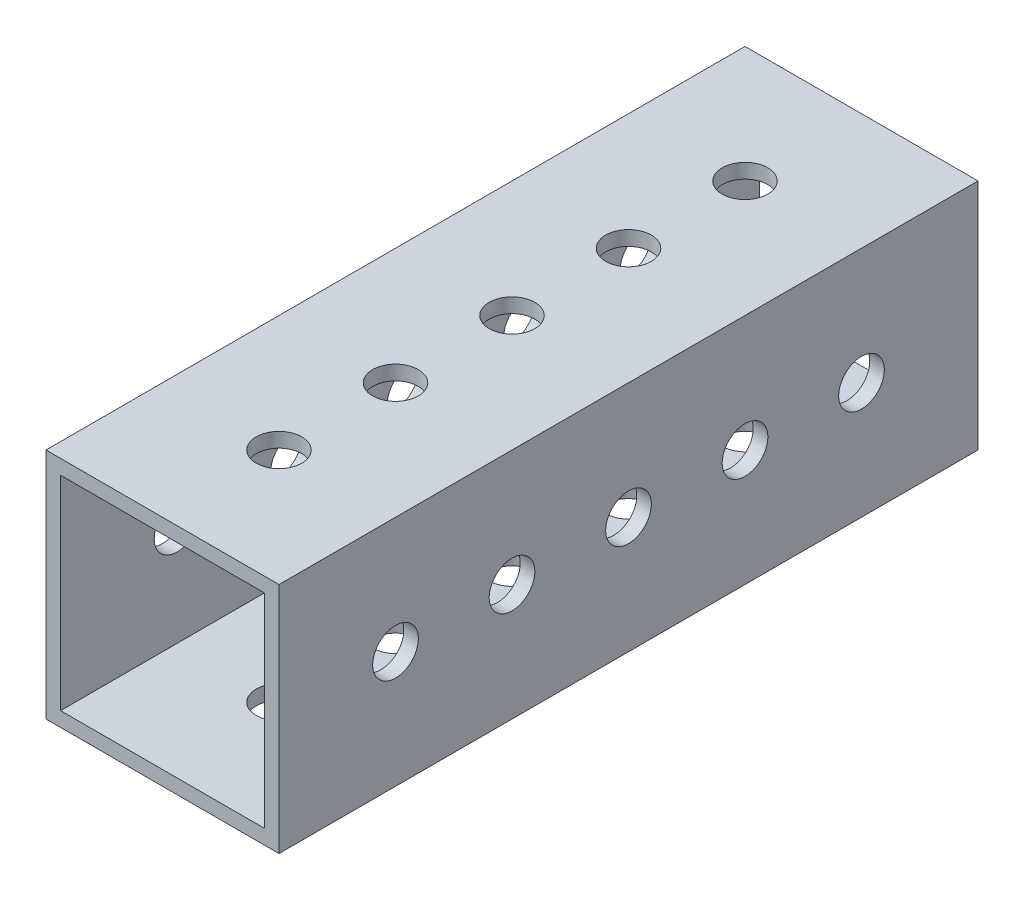
ISO-10303-21;
HEADER;
FILE_DESCRIPTION(('STEP AP214'),'2;1');
FILE_NAME('part.step','',(''),(''),'','','');
FILE_SCHEMA(('AUTOMOTIVE_DESIGN { 1 0 10303 214 1 1 1 1 }'));
ENDSEC;
DATA;
#1=APPLICATION_CONTEXT('core data for automotive mechanical design processes');
#2=APPLICATION_PROTOCOL_DEFINITION('international standard','automotive_design',2000,#1);
#3=PRODUCT_CONTEXT('',#1,'mechanical');
#4=PRODUCT('Part','Part','',(#3));
#5=PRODUCT_RELATED_PRODUCT_CATEGORY('part','',(#4));
#6=PRODUCT_DEFINITION_FORMATION('','',#4);
#7=PRODUCT_DEFINITION_CONTEXT('part definition',#1,'design');
#8=PRODUCT_DEFINITION('design','',#6,#7);
#9=PRODUCT_DEFINITION_SHAPE('','',#8);
#10=(LENGTH_UNIT() NAMED_UNIT(*) SI_UNIT(.MILLI.,.METRE.));
#11=(NAMED_UNIT(*) PLANE_ANGLE_UNIT() SI_UNIT($,.RADIAN.));
#12=(NAMED_UNIT(*) SI_UNIT($,.STERADIAN.) SOLID_ANGLE_UNIT());
#13=UNCERTAINTY_MEASURE_WITH_UNIT(LENGTH_MEASURE(1.E-05),#10,'distance_accuracy_value','');
#14=(GEOMETRIC_REPRESENTATION_CONTEXT(3) GLOBAL_UNCERTAINTY_ASSIGNED_CONTEXT((#13)) GLOBAL_UNIT_ASSIGNED_CONTEXT((#10,
#11,#12)) REPRESENTATION_CONTEXT('',''));
#15=CARTESIAN_POINT('',(0.,0.,0.));
#16=DIRECTION('',(0.,0.,1.));
#17=DIRECTION('',(1.,0.,0.));
#18=AXIS2_PLACEMENT_3D('',#15,#16,#17);
#19=CARTESIAN_POINT('',(0.,0.,38.1));
#20=DIRECTION('',(0.,0.,-1.));
#21=DIRECTION('',(-1.,0.,0.));
#22=AXIS2_PLACEMENT_3D('',#19,#20,#21);
#23=PLANE('',#22);
#24=DIRECTION('',(0.,1.,0.));
#25=VECTOR('',#24,1.);
#26=CARTESIAN_POINT('',(12.7,-12.7,38.1));
#27=LINE('',#26,#25);
#28=CARTESIAN_POINT('',(12.7,-12.7,38.1));
#29=VERTEX_POINT('',#28);
#30=CARTESIAN_POINT('',(12.7,12.7,38.1));
#31=VERTEX_POINT('',#30);
#32=EDGE_CURVE('E154',#29,#31,#27,.T.);
#33=ORIENTED_EDGE('',*,*,#32,.T.);
#34=DIRECTION('',(-1.,0.,0.));
#35=VECTOR('',#34,1.);
#36=CARTESIAN_POINT('',(-12.7,12.7,38.1));
#37=LINE('',#36,#35);
#38=CARTESIAN_POINT('',(-12.7,12.7,38.1));
#39=VERTEX_POINT('',#38);
#40=EDGE_CURVE('E158',#31,#39,#37,.T.);
#41=ORIENTED_EDGE('',*,*,#40,.T.);
#42=DIRECTION('',(0.,-1.,0.));
#43=VECTOR('',#42,1.);
#44=CARTESIAN_POINT('',(-12.7,-12.7,38.1));
#45=LINE('',#44,#43);
#46=CARTESIAN_POINT('',(-12.7,-12.7,38.1));
#47=VERTEX_POINT('',#46);
#48=EDGE_CURVE('E162',#39,#47,#45,.T.);
#49=ORIENTED_EDGE('',*,*,#48,.T.);
#50=DIRECTION('',(1.,0.,0.));
#51=VECTOR('',#50,1.);
#52=CARTESIAN_POINT('',(-12.7,-12.7,38.1));
#53=LINE('',#52,#51);
#54=EDGE_CURVE('E165',#47,#29,#53,.T.);
#55=ORIENTED_EDGE('',*,*,#54,.T.);
#56=EDGE_LOOP('',(#33,#41,#49,#55));
#57=FACE_BOUND('',#56,.T.);
#58=DIRECTION('',(0.,1.,0.));
#59=VECTOR('',#58,1.);
#60=CARTESIAN_POINT('',(11.1125,0.,38.1));
#61=LINE('',#60,#59);
#62=CARTESIAN_POINT('',(11.1125,-11.1125,38.1));
#63=VERTEX_POINT('',#62);
#64=CARTESIAN_POINT('',(11.1125,11.1125,38.1));
#65=VERTEX_POINT('',#64);
#66=EDGE_CURVE('E136',#63,#65,#61,.T.);
#67=ORIENTED_EDGE('',*,*,#66,.F.);
#68=DIRECTION('',(1.,0.,0.));
#69=VECTOR('',#68,1.);
#70=CARTESIAN_POINT('',(0.,-11.1125,38.1));
#71=LINE('',#70,#69);
#72=CARTESIAN_POINT('',(-11.1125,-11.1125,38.1));
#73=VERTEX_POINT('',#72);
#74=EDGE_CURVE('E117',#73,#63,#71,.T.);
#75=ORIENTED_EDGE('',*,*,#74,.F.);
#76=DIRECTION('',(0.,-1.,0.));
#77=VECTOR('',#76,1.);
#78=CARTESIAN_POINT('',(-11.1125,0.,38.1));
#79=LINE('',#78,#77);
#80=CARTESIAN_POINT('',(-11.1125,11.1125,38.1));
#81=VERTEX_POINT('',#80);
#82=EDGE_CURVE('E149',#81,#73,#79,.T.);
#83=ORIENTED_EDGE('',*,*,#82,.F.);
#84=DIRECTION('',(-1.,0.,0.));
#85=VECTOR('',#84,1.);
#86=CARTESIAN_POINT('',(0.,11.1125,38.1));
#87=LINE('',#86,#85);
#88=EDGE_CURVE('E140',#65,#81,#87,.T.);
#89=ORIENTED_EDGE('',*,*,#88,.F.);
#90=EDGE_LOOP('',(#67,#75,#83,#89));
#91=FACE_BOUND('',#90,.T.);
#92=ADVANCED_FACE('F44',(#57,#91),#23,.F.);
#93=CARTESIAN_POINT('',(0.,0.,-38.1));
#94=DIRECTION('',(0.,0.,-1.));
#95=DIRECTION('',(-1.,0.,0.));
#96=AXIS2_PLACEMENT_3D('',#93,#94,#95);
#97=PLANE('',#96);
#98=DIRECTION('',(0.,1.,0.));
#99=VECTOR('',#98,1.);
#100=CARTESIAN_POINT('',(12.7,-12.7,-38.1));
#101=LINE('',#100,#99);
#102=CARTESIAN_POINT('',(12.7,-12.7,-38.1));
#103=VERTEX_POINT('',#102);
#104=CARTESIAN_POINT('',(12.7,12.7,-38.1));
#105=VERTEX_POINT('',#104);
#106=EDGE_CURVE('E169',#103,#105,#101,.T.);
#107=ORIENTED_EDGE('',*,*,#106,.F.);
#108=DIRECTION('',(1.,0.,0.));
#109=VECTOR('',#108,1.);
#110=CARTESIAN_POINT('',(-12.7,-12.7,-38.1));
#111=LINE('',#110,#109);
#112=CARTESIAN_POINT('',(-12.7,-12.7,-38.1));
#113=VERTEX_POINT('',#112);
#114=EDGE_CURVE('E159',#113,#103,#111,.T.);
#115=ORIENTED_EDGE('',*,*,#114,.F.);
#116=DIRECTION('',(0.,-1.,0.));
#117=VECTOR('',#116,1.);
#118=CARTESIAN_POINT('',(-12.7,-12.7,-38.1));
#119=LINE('',#118,#117);
#120=CARTESIAN_POINT('',(-12.7,12.7,-38.1));
#121=VERTEX_POINT('',#120);
#122=EDGE_CURVE('E176',#121,#113,#119,.T.);
#123=ORIENTED_EDGE('',*,*,#122,.F.);
#124=DIRECTION('',(-1.,0.,0.));
#125=VECTOR('',#124,1.);
#126=CARTESIAN_POINT('',(-12.7,12.7,-38.1));
#127=LINE('',#126,#125);
#128=EDGE_CURVE('E173',#105,#121,#127,.T.);
#129=ORIENTED_EDGE('',*,*,#128,.F.);
#130=EDGE_LOOP('',(#107,#115,#123,#129));
#131=FACE_BOUND('',#130,.T.);
#132=DIRECTION('',(1.,0.,0.));
#133=VECTOR('',#132,1.);
#134=CARTESIAN_POINT('',(0.,-11.1125,-38.1));
#135=LINE('',#134,#133);
#136=CARTESIAN_POINT('',(-11.1125,-11.1125,-38.1));
#137=VERTEX_POINT('',#136);
#138=CARTESIAN_POINT('',(11.1125,-11.1125,-38.1));
#139=VERTEX_POINT('',#138);
#140=EDGE_CURVE('E115',#137,#139,#135,.T.);
#141=ORIENTED_EDGE('',*,*,#140,.T.);
#142=DIRECTION('',(0.,1.,0.));
#143=VECTOR('',#142,1.);
#144=CARTESIAN_POINT('',(11.1125,0.,-38.1));
#145=LINE('',#144,#143);
#146=CARTESIAN_POINT('',(11.1125,11.1125,-38.1));
#147=VERTEX_POINT('',#146);
#148=EDGE_CURVE('E124',#139,#147,#145,.T.);
#149=ORIENTED_EDGE('',*,*,#148,.T.);
#150=DIRECTION('',(-1.,0.,0.));
#151=VECTOR('',#150,1.);
#152=CARTESIAN_POINT('',(0.,11.1125,-38.1));
#153=LINE('',#152,#151);
#154=CARTESIAN_POINT('',(-11.1125,11.1125,-38.1));
#155=VERTEX_POINT('',#154);
#156=EDGE_CURVE('E131',#147,#155,#153,.T.);
#157=ORIENTED_EDGE('',*,*,#156,.T.);
#158=DIRECTION('',(0.,-1.,0.));
#159=VECTOR('',#158,1.);
#160=CARTESIAN_POINT('',(-11.1125,0.,-38.1));
#161=LINE('',#160,#159);
#162=EDGE_CURVE('E69',#155,#137,#161,.T.);
#163=ORIENTED_EDGE('',*,*,#162,.T.);
#164=EDGE_LOOP('',(#141,#149,#157,#163));
#165=FACE_BOUND('',#164,.T.);
#166=ADVANCED_FACE('F134',(#131,#165),#97,.T.);
#167=CARTESIAN_POINT('',(12.7,-12.7,38.1));
#168=DIRECTION('',(-1.,0.,0.));
#169=DIRECTION('',(0.,0.,1.));
#170=AXIS2_PLACEMENT_3D('',#167,#168,#169);
#171=PLANE('',#170);
#172=CARTESIAN_POINT('',(12.7,0.,-25.4));
#173=DIRECTION('',(-1.,0.,0.));
#174=DIRECTION('',(0.,0.,1.));
#175=AXIS2_PLACEMENT_3D('',#172,#173,#174);
#176=CIRCLE('',#175,2.4892);
#177=CARTESIAN_POINT('',(12.7,0.,-22.9108));
#178=VERTEX_POINT('',#177);
#179=EDGE_CURVE('E221',#178,#178,#176,.T.);
#180=ORIENTED_EDGE('',*,*,#179,.T.);
#181=EDGE_LOOP('',(#180));
#182=FACE_BOUND('',#181,.T.);
#183=CARTESIAN_POINT('',(12.7,0.,-12.7));
#184=DIRECTION('',(-1.,0.,0.));
#185=DIRECTION('',(0.,0.,1.));
#186=AXIS2_PLACEMENT_3D('',#183,#184,#185);
#187=CIRCLE('',#186,2.4892);
#188=CARTESIAN_POINT('',(12.7,0.,-10.2108));
#189=VERTEX_POINT('',#188);
#190=EDGE_CURVE('E505',#189,#189,#187,.T.);
#191=ORIENTED_EDGE('',*,*,#190,.T.);
#192=EDGE_LOOP('',(#191));
#193=FACE_BOUND('',#192,.T.);
#194=CARTESIAN_POINT('',(12.7,0.,0.));
#195=DIRECTION('',(-1.,0.,0.));
#196=DIRECTION('',(0.,0.,1.));
#197=AXIS2_PLACEMENT_3D('',#194,#195,#196);
#198=CIRCLE('',#197,2.4892);
#199=CARTESIAN_POINT('',(12.7,0.,2.4892));
#200=VERTEX_POINT('',#199);
#201=EDGE_CURVE('E513',#200,#200,#198,.T.);
#202=ORIENTED_EDGE('',*,*,#201,.T.);
#203=EDGE_LOOP('',(#202));
#204=FACE_BOUND('',#203,.T.);
#205=CARTESIAN_POINT('',(12.7,0.,12.7));
#206=DIRECTION('',(-1.,0.,0.));
#207=DIRECTION('',(0.,0.,1.));
#208=AXIS2_PLACEMENT_3D('',#205,#206,#207);
#209=CIRCLE('',#208,2.4892);
#210=CARTESIAN_POINT('',(12.7,0.,15.1892));
#211=VERTEX_POINT('',#210);
#212=EDGE_CURVE('E521',#211,#211,#209,.T.);
#213=ORIENTED_EDGE('',*,*,#212,.T.);
#214=EDGE_LOOP('',(#213));
#215=FACE_BOUND('',#214,.T.);
#216=CARTESIAN_POINT('',(12.7,0.,25.4));
#217=DIRECTION('',(-1.,0.,0.));
#218=DIRECTION('',(0.,0.,1.));
#219=AXIS2_PLACEMENT_3D('',#216,#217,#218);
#220=CIRCLE('',#219,2.4892);
#221=CARTESIAN_POINT('',(12.7,0.,27.8892));
#222=VERTEX_POINT('',#221);
#223=EDGE_CURVE('E529',#222,#222,#220,.T.);
#224=ORIENTED_EDGE('',*,*,#223,.T.);
#225=EDGE_LOOP('',(#224));
#226=FACE_BOUND('',#225,.T.);
#227=ORIENTED_EDGE('',*,*,#106,.T.);
#228=DIRECTION('',(0.,0.,-1.));
#229=VECTOR('',#228,1.);
#230=CARTESIAN_POINT('',(12.7,12.7,38.1));
#231=LINE('',#230,#229);
#232=EDGE_CURVE('E11',#31,#105,#231,.T.);
#233=ORIENTED_EDGE('',*,*,#232,.F.);
#234=ORIENTED_EDGE('',*,*,#32,.F.);
#235=DIRECTION('',(0.,0.,-1.));
#236=VECTOR('',#235,1.);
#237=CARTESIAN_POINT('',(12.7,-12.7,38.1));
#238=LINE('',#237,#236);
#239=EDGE_CURVE('E168',#29,#103,#238,.T.);
#240=ORIENTED_EDGE('',*,*,#239,.T.);
#241=EDGE_LOOP('',(#227,#233,#234,#240));
#242=FACE_BOUND('',#241,.T.);
#243=ADVANCED_FACE('F46',(#182,#193,#204,#215,#226,#242),#171,.F.);
#244=CARTESIAN_POINT('',(-12.7,12.7,38.1));
#245=DIRECTION('',(0.,-1.,0.));
#246=DIRECTION('',(0.,0.,-1.));
#247=AXIS2_PLACEMENT_3D('',#244,#245,#246);
#248=PLANE('',#247);
#249=CARTESIAN_POINT('',(0.,12.7,25.4));
#250=DIRECTION('',(0.,1.,0.));
#251=DIRECTION('',(0.,0.,1.));
#252=AXIS2_PLACEMENT_3D('',#249,#250,#251);
#253=CIRCLE('',#252,2.4892);
#254=CARTESIAN_POINT('',(0.,12.7,27.8892));
#255=VERTEX_POINT('',#254);
#256=EDGE_CURVE('E253',#255,#255,#253,.T.);
#257=ORIENTED_EDGE('',*,*,#256,.F.);
#258=EDGE_LOOP('',(#257));
#259=FACE_BOUND('',#258,.T.);
#260=CARTESIAN_POINT('',(0.,12.7,12.7));
#261=DIRECTION('',(0.,1.,0.));
#262=DIRECTION('',(0.,0.,1.));
#263=AXIS2_PLACEMENT_3D('',#260,#261,#262);
#264=CIRCLE('',#263,2.4892);
#265=CARTESIAN_POINT('',(0.,12.7,15.1892));
#266=VERTEX_POINT('',#265);
#267=EDGE_CURVE('E257',#266,#266,#264,.T.);
#268=ORIENTED_EDGE('',*,*,#267,.F.);
#269=EDGE_LOOP('',(#268));
#270=FACE_BOUND('',#269,.T.);
#271=CARTESIAN_POINT('',(0.,12.7,0.));
#272=DIRECTION('',(0.,1.,0.));
#273=DIRECTION('',(0.,0.,1.));
#274=AXIS2_PLACEMENT_3D('',#271,#272,#273);
#275=CIRCLE('',#274,2.4892);
#276=CARTESIAN_POINT('',(0.,12.7,2.48920000000001));
#277=VERTEX_POINT('',#276);
#278=EDGE_CURVE('E265',#277,#277,#275,.T.);
#279=ORIENTED_EDGE('',*,*,#278,.F.);
#280=EDGE_LOOP('',(#279));
#281=FACE_BOUND('',#280,.T.);
#282=CARTESIAN_POINT('',(0.,12.7,-12.7));
#283=DIRECTION('',(0.,1.,0.));
#284=DIRECTION('',(0.,0.,1.));
#285=AXIS2_PLACEMENT_3D('',#282,#283,#284);
#286=CIRCLE('',#285,2.4892);
#287=CARTESIAN_POINT('',(0.,12.7,-10.2108));
#288=VERTEX_POINT('',#287);
#289=EDGE_CURVE('E273',#288,#288,#286,.T.);
#290=ORIENTED_EDGE('',*,*,#289,.F.);
#291=EDGE_LOOP('',(#290));
#292=FACE_BOUND('',#291,.T.);
#293=CARTESIAN_POINT('',(0.,12.7,-25.4));
#294=DIRECTION('',(0.,1.,0.));
#295=DIRECTION('',(0.,0.,1.));
#296=AXIS2_PLACEMENT_3D('',#293,#294,#295);
#297=CIRCLE('',#296,2.4892);
#298=CARTESIAN_POINT('',(0.,12.7,-22.9108));
#299=VERTEX_POINT('',#298);
#300=EDGE_CURVE('E281',#299,#299,#297,.T.);
#301=ORIENTED_EDGE('',*,*,#300,.F.);
#302=EDGE_LOOP('',(#301));
#303=FACE_BOUND('',#302,.T.);
#304=ORIENTED_EDGE('',*,*,#128,.T.);
#305=DIRECTION('',(0.,0.,-1.));
#306=VECTOR('',#305,1.);
#307=CARTESIAN_POINT('',(-12.7,12.7,38.1));
#308=LINE('',#307,#306);
#309=EDGE_CURVE('E54',#39,#121,#308,.T.);
#310=ORIENTED_EDGE('',*,*,#309,.F.);
#311=ORIENTED_EDGE('',*,*,#40,.F.);
#312=ORIENTED_EDGE('',*,*,#232,.T.);
#313=EDGE_LOOP('',(#304,#310,#311,#312));
#314=FACE_BOUND('',#313,.T.);
#315=ADVANCED_FACE('F347',(#259,#270,#281,#292,#303,#314),#248,.F.);
#316=CARTESIAN_POINT('',(-12.7,-12.7,38.1));
#317=DIRECTION('',(1.,0.,0.));
#318=DIRECTION('',(0.,0.,-1.));
#319=AXIS2_PLACEMENT_3D('',#316,#317,#318);
#320=PLANE('',#319);
#321=CARTESIAN_POINT('',(-12.7,0.,-25.4));
#322=DIRECTION('',(-1.,0.,0.));
#323=DIRECTION('',(0.,0.,1.));
#324=AXIS2_PLACEMENT_3D('',#321,#322,#323);
#325=CIRCLE('',#324,2.4892);
#326=CARTESIAN_POINT('',(-12.7,0.,-22.9108));
#327=VERTEX_POINT('',#326);
#328=EDGE_CURVE('E495',#327,#327,#325,.T.);
#329=ORIENTED_EDGE('',*,*,#328,.F.);
#330=EDGE_LOOP('',(#329));
#331=FACE_BOUND('',#330,.T.);
#332=CARTESIAN_POINT('',(-12.7,0.,-12.7));
#333=DIRECTION('',(-1.,0.,0.));
#334=DIRECTION('',(0.,0.,1.));
#335=AXIS2_PLACEMENT_3D('',#332,#333,#334);
#336=CIRCLE('',#335,2.4892);
#337=CARTESIAN_POINT('',(-12.7,0.,-10.2108));
#338=VERTEX_POINT('',#337);
#339=EDGE_CURVE('E499',#338,#338,#336,.T.);
#340=ORIENTED_EDGE('',*,*,#339,.F.);
#341=EDGE_LOOP('',(#340));
#342=FACE_BOUND('',#341,.T.);
#343=CARTESIAN_POINT('',(-12.7,0.,0.));
#344=DIRECTION('',(-1.,0.,0.));
#345=DIRECTION('',(0.,0.,1.));
#346=AXIS2_PLACEMENT_3D('',#343,#344,#345);
#347=CIRCLE('',#346,2.4892);
#348=CARTESIAN_POINT('',(-12.7,0.,2.4892));
#349=VERTEX_POINT('',#348);
#350=EDGE_CURVE('E509',#349,#349,#347,.T.);
#351=ORIENTED_EDGE('',*,*,#350,.F.);
#352=EDGE_LOOP('',(#351));
#353=FACE_BOUND('',#352,.T.);
#354=CARTESIAN_POINT('',(-12.7,0.,12.7));
#355=DIRECTION('',(-1.,0.,0.));
#356=DIRECTION('',(0.,0.,1.));
#357=AXIS2_PLACEMENT_3D('',#354,#355,#356);
#358=CIRCLE('',#357,2.4892);
#359=CARTESIAN_POINT('',(-12.7,0.,15.1892));
#360=VERTEX_POINT('',#359);
#361=EDGE_CURVE('E517',#360,#360,#358,.T.);
#362=ORIENTED_EDGE('',*,*,#361,.F.);
#363=EDGE_LOOP('',(#362));
#364=FACE_BOUND('',#363,.T.);
#365=CARTESIAN_POINT('',(-12.7,0.,25.4));
#366=DIRECTION('',(-1.,0.,0.));
#367=DIRECTION('',(0.,0.,1.));
#368=AXIS2_PLACEMENT_3D('',#365,#366,#367);
#369=CIRCLE('',#368,2.4892);
#370=CARTESIAN_POINT('',(-12.7,0.,27.8892));
#371=VERTEX_POINT('',#370);
#372=EDGE_CURVE('E525',#371,#371,#369,.T.);
#373=ORIENTED_EDGE('',*,*,#372,.F.);
#374=EDGE_LOOP('',(#373));
#375=FACE_BOUND('',#374,.T.);
#376=ORIENTED_EDGE('',*,*,#122,.T.);
#377=DIRECTION('',(0.,0.,-1.));
#378=VECTOR('',#377,1.);
#379=CARTESIAN_POINT('',(-12.7,-12.7,38.1));
#380=LINE('',#379,#378);
#381=EDGE_CURVE('E184',#47,#113,#380,.T.);
#382=ORIENTED_EDGE('',*,*,#381,.F.);
#383=ORIENTED_EDGE('',*,*,#48,.F.);
#384=ORIENTED_EDGE('',*,*,#309,.T.);
#385=EDGE_LOOP('',(#376,#382,#383,#384));
#386=FACE_BOUND('',#385,.T.);
#387=ADVANCED_FACE('F344',(#331,#342,#353,#364,#375,#386),#320,.F.);
#388=CARTESIAN_POINT('',(-12.7,-12.7,38.1));
#389=DIRECTION('',(0.,1.,0.));
#390=DIRECTION('',(0.,0.,1.));
#391=AXIS2_PLACEMENT_3D('',#388,#389,#390);
#392=PLANE('',#391);
#393=CARTESIAN_POINT('',(0.,-12.7,25.4));
#394=DIRECTION('',(0.,1.,0.));
#395=DIRECTION('',(0.,0.,1.));
#396=AXIS2_PLACEMENT_3D('',#393,#394,#395);
#397=CIRCLE('',#396,2.4892);
#398=CARTESIAN_POINT('',(0.,-12.7,27.8892));
#399=VERTEX_POINT('',#398);
#400=EDGE_CURVE('E196',#399,#399,#397,.T.);
#401=ORIENTED_EDGE('',*,*,#400,.T.);
#402=EDGE_LOOP('',(#401));
#403=FACE_BOUND('',#402,.T.);
#404=CARTESIAN_POINT('',(0.,-12.7,12.7));
#405=DIRECTION('',(0.,1.,0.));
#406=DIRECTION('',(0.,0.,1.));
#407=AXIS2_PLACEMENT_3D('',#404,#405,#406);
#408=CIRCLE('',#407,2.4892);
#409=CARTESIAN_POINT('',(0.,-12.7,15.1892));
#410=VERTEX_POINT('',#409);
#411=EDGE_CURVE('E261',#410,#410,#408,.T.);
#412=ORIENTED_EDGE('',*,*,#411,.T.);
#413=EDGE_LOOP('',(#412));
#414=FACE_BOUND('',#413,.T.);
#415=CARTESIAN_POINT('',(0.,-12.7,0.));
#416=DIRECTION('',(0.,1.,0.));
#417=DIRECTION('',(0.,0.,1.));
#418=AXIS2_PLACEMENT_3D('',#415,#416,#417);
#419=CIRCLE('',#418,2.4892);
#420=CARTESIAN_POINT('',(0.,-12.7,2.48920000000001));
#421=VERTEX_POINT('',#420);
#422=EDGE_CURVE('E269',#421,#421,#419,.T.);
#423=ORIENTED_EDGE('',*,*,#422,.T.);
#424=EDGE_LOOP('',(#423));
#425=FACE_BOUND('',#424,.T.);
#426=CARTESIAN_POINT('',(0.,-12.7,-12.7));
#427=DIRECTION('',(0.,1.,0.));
#428=DIRECTION('',(0.,0.,1.));
#429=AXIS2_PLACEMENT_3D('',#426,#427,#428);
#430=CIRCLE('',#429,2.4892);
#431=CARTESIAN_POINT('',(0.,-12.7,-10.2108));
#432=VERTEX_POINT('',#431);
#433=EDGE_CURVE('E277',#432,#432,#430,.T.);
#434=ORIENTED_EDGE('',*,*,#433,.T.);
#435=EDGE_LOOP('',(#434));
#436=FACE_BOUND('',#435,.T.);
#437=CARTESIAN_POINT('',(0.,-12.7,-25.4));
#438=DIRECTION('',(0.,1.,0.));
#439=DIRECTION('',(0.,0.,1.));
#440=AXIS2_PLACEMENT_3D('',#437,#438,#439);
#441=CIRCLE('',#440,2.4892);
#442=CARTESIAN_POINT('',(0.,-12.7,-22.9108));
#443=VERTEX_POINT('',#442);
#444=EDGE_CURVE('E252',#443,#443,#441,.T.);
#445=ORIENTED_EDGE('',*,*,#444,.T.);
#446=EDGE_LOOP('',(#445));
#447=FACE_BOUND('',#446,.T.);
#448=ORIENTED_EDGE('',*,*,#114,.T.);
#449=ORIENTED_EDGE('',*,*,#239,.F.);
#450=ORIENTED_EDGE('',*,*,#54,.F.);
#451=ORIENTED_EDGE('',*,*,#381,.T.);
#452=EDGE_LOOP('',(#448,#449,#450,#451));
#453=FACE_BOUND('',#452,.T.);
#454=ADVANCED_FACE('F328',(#403,#414,#425,#436,#447,#453),#392,.F.);
#455=CARTESIAN_POINT('',(11.1125,-12.7,38.1));
#456=DIRECTION('',(-1.,0.,0.));
#457=DIRECTION('',(0.,0.,1.));
#458=AXIS2_PLACEMENT_3D('',#455,#456,#457);
#459=PLANE('',#458);
#460=CARTESIAN_POINT('',(11.1125,0.,-25.4));
#461=DIRECTION('',(-1.,0.,0.));
#462=DIRECTION('',(0.,0.,1.));
#463=AXIS2_PLACEMENT_3D('',#460,#461,#462);
#464=CIRCLE('',#463,2.4892);
#465=CARTESIAN_POINT('',(11.1125,0.,-22.9108));
#466=VERTEX_POINT('',#465);
#467=EDGE_CURVE('E248',#466,#466,#464,.T.);
#468=ORIENTED_EDGE('',*,*,#467,.F.);
#469=EDGE_LOOP('',(#468));
#470=FACE_BOUND('',#469,.T.);
#471=CARTESIAN_POINT('',(11.1125,0.,-12.7));
#472=DIRECTION('',(-1.,0.,0.));
#473=DIRECTION('',(0.,0.,1.));
#474=AXIS2_PLACEMENT_3D('',#471,#472,#473);
#475=CIRCLE('',#474,2.4892);
#476=CARTESIAN_POINT('',(11.1125,0.,-10.2108));
#477=VERTEX_POINT('',#476);
#478=EDGE_CURVE('E234',#477,#477,#475,.T.);
#479=ORIENTED_EDGE('',*,*,#478,.F.);
#480=EDGE_LOOP('',(#479));
#481=FACE_BOUND('',#480,.T.);
#482=CARTESIAN_POINT('',(11.1125,0.,0.));
#483=DIRECTION('',(-1.,0.,0.));
#484=DIRECTION('',(0.,0.,1.));
#485=AXIS2_PLACEMENT_3D('',#482,#483,#484);
#486=CIRCLE('',#485,2.4892);
#487=CARTESIAN_POINT('',(11.1125,0.,2.4892));
#488=VERTEX_POINT('',#487);
#489=EDGE_CURVE('E230',#488,#488,#486,.T.);
#490=ORIENTED_EDGE('',*,*,#489,.F.);
#491=EDGE_LOOP('',(#490));
#492=FACE_BOUND('',#491,.T.);
#493=CARTESIAN_POINT('',(11.1125,0.,12.7));
#494=DIRECTION('',(-1.,0.,0.));
#495=DIRECTION('',(0.,0.,1.));
#496=AXIS2_PLACEMENT_3D('',#493,#494,#495);
#497=CIRCLE('',#496,2.4892);
#498=CARTESIAN_POINT('',(11.1125,0.,15.1892));
#499=VERTEX_POINT('',#498);
#500=EDGE_CURVE('E226',#499,#499,#497,.T.);
#501=ORIENTED_EDGE('',*,*,#500,.F.);
#502=EDGE_LOOP('',(#501));
#503=FACE_BOUND('',#502,.T.);
#504=CARTESIAN_POINT('',(11.1125,0.,25.4));
#505=DIRECTION('',(-1.,0.,0.));
#506=DIRECTION('',(0.,0.,1.));
#507=AXIS2_PLACEMENT_3D('',#504,#505,#506);
#508=CIRCLE('',#507,2.4892);
#509=CARTESIAN_POINT('',(11.1125,0.,27.8892));
#510=VERTEX_POINT('',#509);
#511=EDGE_CURVE('E220',#510,#510,#508,.T.);
#512=ORIENTED_EDGE('',*,*,#511,.F.);
#513=EDGE_LOOP('',(#512));
#514=FACE_BOUND('',#513,.T.);
#515=ORIENTED_EDGE('',*,*,#148,.F.);
#516=DIRECTION('',(0.,0.,-1.));
#517=VECTOR('',#516,1.);
#518=CARTESIAN_POINT('',(11.1125,-11.1125,38.1));
#519=LINE('',#518,#517);
#520=EDGE_CURVE('E111',#63,#139,#519,.T.);
#521=ORIENTED_EDGE('',*,*,#520,.F.);
#522=ORIENTED_EDGE('',*,*,#66,.T.);
#523=DIRECTION('',(0.,0.,-1.));
#524=VECTOR('',#523,1.);
#525=CARTESIAN_POINT('',(11.1125,11.1125,38.1));
#526=LINE('',#525,#524);
#527=EDGE_CURVE('E127',#65,#147,#526,.T.);
#528=ORIENTED_EDGE('',*,*,#527,.T.);
#529=EDGE_LOOP('',(#515,#521,#522,#528));
#530=FACE_BOUND('',#529,.T.);
#531=ADVANCED_FACE('F125',(#470,#481,#492,#503,#514,#530),#459,.T.);
#532=CARTESIAN_POINT('',(-12.7,11.1125,38.1));
#533=DIRECTION('',(0.,-1.,0.));
#534=DIRECTION('',(0.,0.,-1.));
#535=AXIS2_PLACEMENT_3D('',#532,#533,#534);
#536=PLANE('',#535);
#537=CARTESIAN_POINT('',(0.,11.1125,25.4));
#538=DIRECTION('',(0.,-1.,0.));
#539=DIRECTION('',(0.,0.,-1.));
#540=AXIS2_PLACEMENT_3D('',#537,#538,#539);
#541=CIRCLE('',#540,2.4892);
#542=CARTESIAN_POINT('',(0.,11.1125,22.9108));
#543=VERTEX_POINT('',#542);
#544=EDGE_CURVE('E132',#543,#543,#541,.T.);
#545=ORIENTED_EDGE('',*,*,#544,.F.);
#546=EDGE_LOOP('',(#545));
#547=FACE_BOUND('',#546,.T.);
#548=CARTESIAN_POINT('',(0.,11.1125,12.7));
#549=DIRECTION('',(0.,-1.,0.));
#550=DIRECTION('',(0.,0.,-1.));
#551=AXIS2_PLACEMENT_3D('',#548,#549,#550);
#552=CIRCLE('',#551,2.4892);
#553=CARTESIAN_POINT('',(0.,11.1125,10.2108));
#554=VERTEX_POINT('',#553);
#555=EDGE_CURVE('E211',#554,#554,#552,.T.);
#556=ORIENTED_EDGE('',*,*,#555,.F.);
#557=EDGE_LOOP('',(#556));
#558=FACE_BOUND('',#557,.T.);
#559=CARTESIAN_POINT('',(0.,11.1125,0.));
#560=DIRECTION('',(0.,-1.,0.));
#561=DIRECTION('',(0.,0.,-1.));
#562=AXIS2_PLACEMENT_3D('',#559,#560,#561);
#563=CIRCLE('',#562,2.4892);
#564=CARTESIAN_POINT('',(0.,11.1125,-2.48919999999999));
#565=VERTEX_POINT('',#564);
#566=EDGE_CURVE('E206',#565,#565,#563,.T.);
#567=ORIENTED_EDGE('',*,*,#566,.F.);
#568=EDGE_LOOP('',(#567));
#569=FACE_BOUND('',#568,.T.);
#570=CARTESIAN_POINT('',(0.,11.1125,-12.7));
#571=DIRECTION('',(0.,-1.,0.));
#572=DIRECTION('',(0.,0.,-1.));
#573=AXIS2_PLACEMENT_3D('',#570,#571,#572);
#574=CIRCLE('',#573,2.4892);
#575=CARTESIAN_POINT('',(0.,11.1125,-15.1892));
#576=VERTEX_POINT('',#575);
#577=EDGE_CURVE('E201',#576,#576,#574,.T.);
#578=ORIENTED_EDGE('',*,*,#577,.F.);
#579=EDGE_LOOP('',(#578));
#580=FACE_BOUND('',#579,.T.);
#581=CARTESIAN_POINT('',(0.,11.1125,-25.4));
#582=DIRECTION('',(0.,-1.,0.));
#583=DIRECTION('',(0.,0.,-1.));
#584=AXIS2_PLACEMENT_3D('',#581,#582,#583);
#585=CIRCLE('',#584,2.4892);
#586=CARTESIAN_POINT('',(0.,11.1125,-27.8892));
#587=VERTEX_POINT('',#586);
#588=EDGE_CURVE('E195',#587,#587,#585,.T.);
#589=ORIENTED_EDGE('',*,*,#588,.F.);
#590=EDGE_LOOP('',(#589));
#591=FACE_BOUND('',#590,.T.);
#592=ORIENTED_EDGE('',*,*,#156,.F.);
#593=ORIENTED_EDGE('',*,*,#527,.F.);
#594=ORIENTED_EDGE('',*,*,#88,.T.);
#595=DIRECTION('',(0.,0.,-1.));
#596=VECTOR('',#595,1.);
#597=CARTESIAN_POINT('',(-11.1125,11.1125,38.1));
#598=LINE('',#597,#596);
#599=EDGE_CURVE('E307',#81,#155,#598,.T.);
#600=ORIENTED_EDGE('',*,*,#599,.T.);
#601=EDGE_LOOP('',(#592,#593,#594,#600));
#602=FACE_BOUND('',#601,.T.);
#603=ADVANCED_FACE('F316',(#547,#558,#569,#580,#591,#602),#536,.T.);
#604=CARTESIAN_POINT('',(-11.1125,-12.7,38.1));
#605=DIRECTION('',(1.,0.,0.));
#606=DIRECTION('',(0.,0.,-1.));
#607=AXIS2_PLACEMENT_3D('',#604,#605,#606);
#608=PLANE('',#607);
#609=CARTESIAN_POINT('',(-11.1125,0.,-25.4));
#610=DIRECTION('',(1.,0.,0.));
#611=DIRECTION('',(0.,0.,-1.));
#612=AXIS2_PLACEMENT_3D('',#609,#610,#611);
#613=CIRCLE('',#612,2.4892);
#614=CARTESIAN_POINT('',(-11.1125,0.,-27.8892));
#615=VERTEX_POINT('',#614);
#616=EDGE_CURVE('E48',#615,#615,#613,.T.);
#617=ORIENTED_EDGE('',*,*,#616,.F.);
#618=EDGE_LOOP('',(#617));
#619=FACE_BOUND('',#618,.T.);
#620=CARTESIAN_POINT('',(-11.1125,0.,-12.7));
#621=DIRECTION('',(1.,0.,0.));
#622=DIRECTION('',(0.,0.,-1.));
#623=AXIS2_PLACEMENT_3D('',#620,#621,#622);
#624=CIRCLE('',#623,2.4892);
#625=CARTESIAN_POINT('',(-11.1125,0.,-15.1892));
#626=VERTEX_POINT('',#625);
#627=EDGE_CURVE('E231',#626,#626,#624,.T.);
#628=ORIENTED_EDGE('',*,*,#627,.F.);
#629=EDGE_LOOP('',(#628));
#630=FACE_BOUND('',#629,.T.);
#631=CARTESIAN_POINT('',(-11.1125,0.,0.));
#632=DIRECTION('',(1.,0.,0.));
#633=DIRECTION('',(0.,0.,-1.));
#634=AXIS2_PLACEMENT_3D('',#631,#632,#633);
#635=CIRCLE('',#634,2.4892);
#636=CARTESIAN_POINT('',(-11.1125,0.,-2.4892));
#637=VERTEX_POINT('',#636);
#638=EDGE_CURVE('E227',#637,#637,#635,.T.);
#639=ORIENTED_EDGE('',*,*,#638,.F.);
#640=EDGE_LOOP('',(#639));
#641=FACE_BOUND('',#640,.T.);
#642=CARTESIAN_POINT('',(-11.1125,0.,12.7));
#643=DIRECTION('',(1.,0.,0.));
#644=DIRECTION('',(0.,0.,-1.));
#645=AXIS2_PLACEMENT_3D('',#642,#643,#644);
#646=CIRCLE('',#645,2.4892);
#647=CARTESIAN_POINT('',(-11.1125,0.,10.2108));
#648=VERTEX_POINT('',#647);
#649=EDGE_CURVE('E222',#648,#648,#646,.T.);
#650=ORIENTED_EDGE('',*,*,#649,.F.);
#651=EDGE_LOOP('',(#650));
#652=FACE_BOUND('',#651,.T.);
#653=CARTESIAN_POINT('',(-11.1125,0.,25.4));
#654=DIRECTION('',(1.,0.,0.));
#655=DIRECTION('',(0.,0.,-1.));
#656=AXIS2_PLACEMENT_3D('',#653,#654,#655);
#657=CIRCLE('',#656,2.4892);
#658=CARTESIAN_POINT('',(-11.1125,0.,22.9108));
#659=VERTEX_POINT('',#658);
#660=EDGE_CURVE('E216',#659,#659,#657,.T.);
#661=ORIENTED_EDGE('',*,*,#660,.F.);
#662=EDGE_LOOP('',(#661));
#663=FACE_BOUND('',#662,.T.);
#664=ORIENTED_EDGE('',*,*,#162,.F.);
#665=ORIENTED_EDGE('',*,*,#599,.F.);
#666=ORIENTED_EDGE('',*,*,#82,.T.);
#667=DIRECTION('',(0.,0.,-1.));
#668=VECTOR('',#667,1.);
#669=CARTESIAN_POINT('',(-11.1125,-11.1125,38.1));
#670=LINE('',#669,#668);
#671=EDGE_CURVE('E62',#73,#137,#670,.T.);
#672=ORIENTED_EDGE('',*,*,#671,.T.);
#673=EDGE_LOOP('',(#664,#665,#666,#672));
#674=FACE_BOUND('',#673,.T.);
#675=ADVANCED_FACE('F311',(#619,#630,#641,#652,#663,#674),#608,.T.);
#676=CARTESIAN_POINT('',(-12.7,-11.1125,38.1));
#677=DIRECTION('',(0.,1.,0.));
#678=DIRECTION('',(0.,0.,1.));
#679=AXIS2_PLACEMENT_3D('',#676,#677,#678);
#680=PLANE('',#679);
#681=CARTESIAN_POINT('',(0.,-11.1125,25.4));
#682=DIRECTION('',(0.,1.,0.));
#683=DIRECTION('',(0.,0.,1.));
#684=AXIS2_PLACEMENT_3D('',#681,#682,#683);
#685=CIRCLE('',#684,2.4892);
#686=CARTESIAN_POINT('',(0.,-11.1125,27.8892));
#687=VERTEX_POINT('',#686);
#688=EDGE_CURVE('E212',#687,#687,#685,.T.);
#689=ORIENTED_EDGE('',*,*,#688,.F.);
#690=EDGE_LOOP('',(#689));
#691=FACE_BOUND('',#690,.T.);
#692=CARTESIAN_POINT('',(0.,-11.1125,12.7));
#693=DIRECTION('',(0.,1.,0.));
#694=DIRECTION('',(0.,0.,1.));
#695=AXIS2_PLACEMENT_3D('',#692,#693,#694);
#696=CIRCLE('',#695,2.4892);
#697=CARTESIAN_POINT('',(0.,-11.1125,15.1892));
#698=VERTEX_POINT('',#697);
#699=EDGE_CURVE('E207',#698,#698,#696,.T.);
#700=ORIENTED_EDGE('',*,*,#699,.F.);
#701=EDGE_LOOP('',(#700));
#702=FACE_BOUND('',#701,.T.);
#703=CARTESIAN_POINT('',(0.,-11.1125,0.));
#704=DIRECTION('',(0.,1.,0.));
#705=DIRECTION('',(0.,0.,1.));
#706=AXIS2_PLACEMENT_3D('',#703,#704,#705);
#707=CIRCLE('',#706,2.4892);
#708=CARTESIAN_POINT('',(0.,-11.1125,2.48920000000001));
#709=VERTEX_POINT('',#708);
#710=EDGE_CURVE('E202',#709,#709,#707,.T.);
#711=ORIENTED_EDGE('',*,*,#710,.F.);
#712=EDGE_LOOP('',(#711));
#713=FACE_BOUND('',#712,.T.);
#714=CARTESIAN_POINT('',(0.,-11.1125,-12.7));
#715=DIRECTION('',(0.,1.,0.));
#716=DIRECTION('',(0.,0.,1.));
#717=AXIS2_PLACEMENT_3D('',#714,#715,#716);
#718=CIRCLE('',#717,2.4892);
#719=CARTESIAN_POINT('',(0.,-11.1125,-10.2108));
#720=VERTEX_POINT('',#719);
#721=EDGE_CURVE('E197',#720,#720,#718,.T.);
#722=ORIENTED_EDGE('',*,*,#721,.F.);
#723=EDGE_LOOP('',(#722));
#724=FACE_BOUND('',#723,.T.);
#725=CARTESIAN_POINT('',(0.,-11.1125,-25.4));
#726=DIRECTION('',(0.,1.,0.));
#727=DIRECTION('',(0.,0.,1.));
#728=AXIS2_PLACEMENT_3D('',#725,#726,#727);
#729=CIRCLE('',#728,2.4892);
#730=CARTESIAN_POINT('',(0.,-11.1125,-22.9108));
#731=VERTEX_POINT('',#730);
#732=EDGE_CURVE('E191',#731,#731,#729,.T.);
#733=ORIENTED_EDGE('',*,*,#732,.F.);
#734=EDGE_LOOP('',(#733));
#735=FACE_BOUND('',#734,.T.);
#736=ORIENTED_EDGE('',*,*,#140,.F.);
#737=ORIENTED_EDGE('',*,*,#671,.F.);
#738=ORIENTED_EDGE('',*,*,#74,.T.);
#739=ORIENTED_EDGE('',*,*,#520,.T.);
#740=EDGE_LOOP('',(#736,#737,#738,#739));
#741=FACE_BOUND('',#740,.T.);
#742=ADVANCED_FACE('F113',(#691,#702,#713,#724,#735,#741),#680,.T.);
#743=CARTESIAN_POINT('',(0.,-12.7,-25.4));
#744=DIRECTION('',(0.,1.,0.));
#745=DIRECTION('',(0.,0.,1.));
#746=AXIS2_PLACEMENT_3D('',#743,#744,#745);
#747=CYLINDRICAL_SURFACE('',#746,2.4892);
#748=ORIENTED_EDGE('',*,*,#732,.T.);
#749=EDGE_LOOP('',(#748));
#750=FACE_BOUND('',#749,.T.);
#751=ORIENTED_EDGE('',*,*,#444,.F.);
#752=EDGE_LOOP('',(#751));
#753=FACE_BOUND('',#752,.T.);
#754=ADVANCED_FACE('F385',(#750,#753),#747,.F.);
#755=CARTESIAN_POINT('',(0.,-12.7,-12.7));
#756=DIRECTION('',(0.,1.,0.));
#757=DIRECTION('',(0.,0.,1.));
#758=AXIS2_PLACEMENT_3D('',#755,#756,#757);
#759=CYLINDRICAL_SURFACE('',#758,2.4892);
#760=ORIENTED_EDGE('',*,*,#721,.T.);
#761=EDGE_LOOP('',(#760));
#762=FACE_BOUND('',#761,.T.);
#763=ORIENTED_EDGE('',*,*,#433,.F.);
#764=EDGE_LOOP('',(#763));
#765=FACE_BOUND('',#764,.T.);
#766=ADVANCED_FACE('F393',(#762,#765),#759,.F.);
#767=CARTESIAN_POINT('',(0.,-12.7,0.));
#768=DIRECTION('',(0.,1.,0.));
#769=DIRECTION('',(0.,0.,1.));
#770=AXIS2_PLACEMENT_3D('',#767,#768,#769);
#771=CYLINDRICAL_SURFACE('',#770,2.4892);
#772=ORIENTED_EDGE('',*,*,#710,.T.);
#773=EDGE_LOOP('',(#772));
#774=FACE_BOUND('',#773,.T.);
#775=ORIENTED_EDGE('',*,*,#422,.F.);
#776=EDGE_LOOP('',(#775));
#777=FACE_BOUND('',#776,.T.);
#778=ADVANCED_FACE('F403',(#774,#777),#771,.F.);
#779=CARTESIAN_POINT('',(0.,-12.7,12.7));
#780=DIRECTION('',(0.,1.,0.));
#781=DIRECTION('',(0.,0.,1.));
#782=AXIS2_PLACEMENT_3D('',#779,#780,#781);
#783=CYLINDRICAL_SURFACE('',#782,2.4892);
#784=ORIENTED_EDGE('',*,*,#699,.T.);
#785=EDGE_LOOP('',(#784));
#786=FACE_BOUND('',#785,.T.);
#787=ORIENTED_EDGE('',*,*,#411,.F.);
#788=EDGE_LOOP('',(#787));
#789=FACE_BOUND('',#788,.T.);
#790=ADVANCED_FACE('F394',(#786,#789),#783,.F.);
#791=CARTESIAN_POINT('',(0.,-12.7,25.4));
#792=DIRECTION('',(0.,1.,0.));
#793=DIRECTION('',(0.,0.,1.));
#794=AXIS2_PLACEMENT_3D('',#791,#792,#793);
#795=CYLINDRICAL_SURFACE('',#794,2.4892);
#796=ORIENTED_EDGE('',*,*,#688,.T.);
#797=EDGE_LOOP('',(#796));
#798=FACE_BOUND('',#797,.T.);
#799=ORIENTED_EDGE('',*,*,#400,.F.);
#800=EDGE_LOOP('',(#799));
#801=FACE_BOUND('',#800,.T.);
#802=ADVANCED_FACE('F382',(#798,#801),#795,.F.);
#803=ORIENTED_EDGE('',*,*,#588,.T.);
#804=EDGE_LOOP('',(#803));
#805=FACE_BOUND('',#804,.T.);
#806=ORIENTED_EDGE('',*,*,#300,.T.);
#807=EDGE_LOOP('',(#806));
#808=FACE_BOUND('',#807,.T.);
#809=ADVANCED_FACE('F379',(#805,#808),#747,.F.);
#810=ORIENTED_EDGE('',*,*,#577,.T.);
#811=EDGE_LOOP('',(#810));
#812=FACE_BOUND('',#811,.T.);
#813=ORIENTED_EDGE('',*,*,#289,.T.);
#814=EDGE_LOOP('',(#813));
#815=FACE_BOUND('',#814,.T.);
#816=ADVANCED_FACE('F381',(#812,#815),#759,.F.);
#817=ORIENTED_EDGE('',*,*,#566,.T.);
#818=EDGE_LOOP('',(#817));
#819=FACE_BOUND('',#818,.T.);
#820=ORIENTED_EDGE('',*,*,#278,.T.);
#821=EDGE_LOOP('',(#820));
#822=FACE_BOUND('',#821,.T.);
#823=ADVANCED_FACE('F390',(#819,#822),#771,.F.);
#824=ORIENTED_EDGE('',*,*,#555,.T.);
#825=EDGE_LOOP('',(#824));
#826=FACE_BOUND('',#825,.T.);
#827=ORIENTED_EDGE('',*,*,#267,.T.);
#828=EDGE_LOOP('',(#827));
#829=FACE_BOUND('',#828,.T.);
#830=ADVANCED_FACE('F434',(#826,#829),#783,.F.);
#831=ORIENTED_EDGE('',*,*,#544,.T.);
#832=EDGE_LOOP('',(#831));
#833=FACE_BOUND('',#832,.T.);
#834=ORIENTED_EDGE('',*,*,#256,.T.);
#835=EDGE_LOOP('',(#834));
#836=FACE_BOUND('',#835,.T.);
#837=ADVANCED_FACE('F397',(#833,#836),#795,.F.);
#838=CARTESIAN_POINT('',(12.7,0.,25.4));
#839=DIRECTION('',(-1.,0.,0.));
#840=DIRECTION('',(0.,0.,1.));
#841=AXIS2_PLACEMENT_3D('',#838,#839,#840);
#842=CYLINDRICAL_SURFACE('',#841,2.4892);
#843=ORIENTED_EDGE('',*,*,#660,.T.);
#844=EDGE_LOOP('',(#843));
#845=FACE_BOUND('',#844,.T.);
#846=ORIENTED_EDGE('',*,*,#372,.T.);
#847=EDGE_LOOP('',(#846));
#848=FACE_BOUND('',#847,.T.);
#849=ADVANCED_FACE('F452',(#845,#848),#842,.F.);
#850=CARTESIAN_POINT('',(12.7,0.,12.7));
#851=DIRECTION('',(-1.,0.,0.));
#852=DIRECTION('',(0.,0.,1.));
#853=AXIS2_PLACEMENT_3D('',#850,#851,#852);
#854=CYLINDRICAL_SURFACE('',#853,2.4892);
#855=ORIENTED_EDGE('',*,*,#649,.T.);
#856=EDGE_LOOP('',(#855));
#857=FACE_BOUND('',#856,.T.);
#858=ORIENTED_EDGE('',*,*,#361,.T.);
#859=EDGE_LOOP('',(#858));
#860=FACE_BOUND('',#859,.T.);
#861=ADVANCED_FACE('F458',(#857,#860),#854,.F.);
#862=CARTESIAN_POINT('',(12.7,0.,0.));
#863=DIRECTION('',(-1.,0.,0.));
#864=DIRECTION('',(0.,0.,1.));
#865=AXIS2_PLACEMENT_3D('',#862,#863,#864);
#866=CYLINDRICAL_SURFACE('',#865,2.4892);
#867=ORIENTED_EDGE('',*,*,#638,.T.);
#868=EDGE_LOOP('',(#867));
#869=FACE_BOUND('',#868,.T.);
#870=ORIENTED_EDGE('',*,*,#350,.T.);
#871=EDGE_LOOP('',(#870));
#872=FACE_BOUND('',#871,.T.);
#873=ADVANCED_FACE('F463',(#869,#872),#866,.F.);
#874=CARTESIAN_POINT('',(12.7,0.,-12.7));
#875=DIRECTION('',(-1.,0.,0.));
#876=DIRECTION('',(0.,0.,1.));
#877=AXIS2_PLACEMENT_3D('',#874,#875,#876);
#878=CYLINDRICAL_SURFACE('',#877,2.4892);
#879=ORIENTED_EDGE('',*,*,#627,.T.);
#880=EDGE_LOOP('',(#879));
#881=FACE_BOUND('',#880,.T.);
#882=ORIENTED_EDGE('',*,*,#339,.T.);
#883=EDGE_LOOP('',(#882));
#884=FACE_BOUND('',#883,.T.);
#885=ADVANCED_FACE('F468',(#881,#884),#878,.F.);
#886=CARTESIAN_POINT('',(12.7,0.,-25.4));
#887=DIRECTION('',(-1.,0.,0.));
#888=DIRECTION('',(0.,0.,1.));
#889=AXIS2_PLACEMENT_3D('',#886,#887,#888);
#890=CYLINDRICAL_SURFACE('',#889,2.4892);
#891=ORIENTED_EDGE('',*,*,#616,.T.);
#892=EDGE_LOOP('',(#891));
#893=FACE_BOUND('',#892,.T.);
#894=ORIENTED_EDGE('',*,*,#328,.T.);
#895=EDGE_LOOP('',(#894));
#896=FACE_BOUND('',#895,.T.);
#897=ADVANCED_FACE('F473',(#893,#896),#890,.F.);
#898=ORIENTED_EDGE('',*,*,#511,.T.);
#899=EDGE_LOOP('',(#898));
#900=FACE_BOUND('',#899,.T.);
#901=ORIENTED_EDGE('',*,*,#223,.F.);
#902=EDGE_LOOP('',(#901));
#903=FACE_BOUND('',#902,.T.);
#904=ADVANCED_FACE('F460',(#900,#903),#842,.F.);
#905=ORIENTED_EDGE('',*,*,#500,.T.);
#906=EDGE_LOOP('',(#905));
#907=FACE_BOUND('',#906,.T.);
#908=ORIENTED_EDGE('',*,*,#212,.F.);
#909=EDGE_LOOP('',(#908));
#910=FACE_BOUND('',#909,.T.);
#911=ADVANCED_FACE('F465',(#907,#910),#854,.F.);
#912=ORIENTED_EDGE('',*,*,#489,.T.);
#913=EDGE_LOOP('',(#912));
#914=FACE_BOUND('',#913,.T.);
#915=ORIENTED_EDGE('',*,*,#201,.F.);
#916=EDGE_LOOP('',(#915));
#917=FACE_BOUND('',#916,.T.);
#918=ADVANCED_FACE('F470',(#914,#917),#866,.F.);
#919=ORIENTED_EDGE('',*,*,#478,.T.);
#920=EDGE_LOOP('',(#919));
#921=FACE_BOUND('',#920,.T.);
#922=ORIENTED_EDGE('',*,*,#190,.F.);
#923=EDGE_LOOP('',(#922));
#924=FACE_BOUND('',#923,.T.);
#925=ADVANCED_FACE('F474',(#921,#924),#878,.F.);
#926=ORIENTED_EDGE('',*,*,#467,.T.);
#927=EDGE_LOOP('',(#926));
#928=FACE_BOUND('',#927,.T.);
#929=ORIENTED_EDGE('',*,*,#179,.F.);
#930=EDGE_LOOP('',(#929));
#931=FACE_BOUND('',#930,.T.);
#932=ADVANCED_FACE('F477',(#928,#931),#890,.F.);
#933=CLOSED_SHELL('',(#92,#166,#243,#315,#387,#454,#531,#603,#675,#742,#754,#766,#778,#790,#802,
#809,#816,#823,#830,#837,#849,#861,#873,#885,#897,#904,#911,#918,#925,#932));
#934=MANIFOLD_SOLID_BREP('B2',#933);
#935=ADVANCED_BREP_SHAPE_REPRESENTATION('',(#18,#934),#14);
#936=SHAPE_DEFINITION_REPRESENTATION(#9,#935);
ENDSEC;
END-ISO-10303-21;
